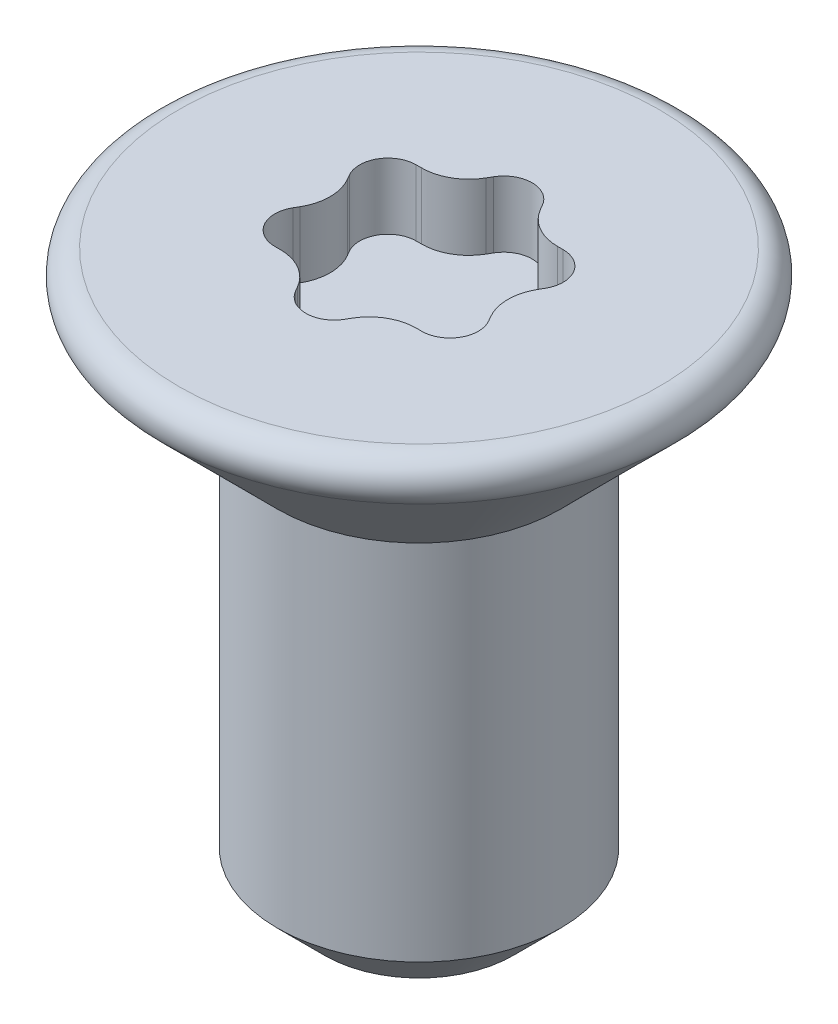
ISO-10303-21;
HEADER;
FILE_DESCRIPTION(('STEP AP214'),'2;1');
FILE_NAME('part.step','',(''),(''),'','','');
FILE_SCHEMA(('AUTOMOTIVE_DESIGN { 1 0 10303 214 1 1 1 1 }'));
ENDSEC;
DATA;
#1=APPLICATION_CONTEXT('core data for automotive mechanical design processes');
#2=APPLICATION_PROTOCOL_DEFINITION('international standard','automotive_design',2000,#1);
#3=PRODUCT_CONTEXT('',#1,'mechanical');
#4=PRODUCT('Part','Part','',(#3));
#5=PRODUCT_RELATED_PRODUCT_CATEGORY('part','',(#4));
#6=PRODUCT_DEFINITION_FORMATION('','',#4);
#7=PRODUCT_DEFINITION_CONTEXT('part definition',#1,'design');
#8=PRODUCT_DEFINITION('design','',#6,#7);
#9=PRODUCT_DEFINITION_SHAPE('','',#8);
#10=(LENGTH_UNIT() NAMED_UNIT(*) SI_UNIT(.MILLI.,.METRE.));
#11=(NAMED_UNIT(*) PLANE_ANGLE_UNIT() SI_UNIT($,.RADIAN.));
#12=(NAMED_UNIT(*) SI_UNIT($,.STERADIAN.) SOLID_ANGLE_UNIT());
#13=UNCERTAINTY_MEASURE_WITH_UNIT(LENGTH_MEASURE(1.E-05),#10,'distance_accuracy_value','');
#14=(GEOMETRIC_REPRESENTATION_CONTEXT(3) GLOBAL_UNCERTAINTY_ASSIGNED_CONTEXT((#13)) GLOBAL_UNIT_ASSIGNED_CONTEXT((#10,
#11,#12)) REPRESENTATION_CONTEXT('',''));
#15=CARTESIAN_POINT('',(0.,0.,0.));
#16=DIRECTION('',(0.,0.,1.));
#17=DIRECTION('',(1.,0.,0.));
#18=AXIS2_PLACEMENT_3D('',#15,#16,#17);
#19=CARTESIAN_POINT('',(-0.721687836487033,-0.7,-1.25));
#20=DIRECTION('',(0.,1.,0.));
#21=DIRECTION('',(0.,0.,1.));
#22=AXIS2_PLACEMENT_3D('',#19,#20,#21);
#23=PLANE('',#22);
#24=CARTESIAN_POINT('',(0.,-0.7,-0.900000000000001));
#25=DIRECTION('',(0.,1.,0.));
#26=DIRECTION('',(0.,0.,1.));
#27=AXIS2_PLACEMENT_3D('',#24,#25,#26);
#28=CIRCLE('',#27,0.3);
#29=CARTESIAN_POINT('',(0.259807621135331,-0.7,-1.05));
#30=VERTEX_POINT('',#29);
#31=CARTESIAN_POINT('',(-0.259807621135332,-0.7,-1.05));
#32=VERTEX_POINT('',#31);
#33=EDGE_CURVE('E259',#30,#32,#28,.T.);
#34=ORIENTED_EDGE('',*,*,#33,.T.);
#35=DIRECTION('',(0.5,0.,-0.866025403784438));
#36=VECTOR('',#35,1.);
#37=CARTESIAN_POINT('',(-0.288675134594814,-0.7,-1.));
#38=LINE('',#37,#36);
#39=CARTESIAN_POINT('',(-0.288675134594814,-0.7,-1.));
#40=VERTEX_POINT('',#39);
#41=EDGE_CURVE('E261',#40,#32,#38,.T.);
#42=ORIENTED_EDGE('',*,*,#41,.F.);
#43=CARTESIAN_POINT('',(-0.721687836487033,-0.7,-1.25));
#44=DIRECTION('',(0.,1.,0.));
#45=DIRECTION('',(0.,0.,1.));
#46=AXIS2_PLACEMENT_3D('',#43,#44,#45);
#47=CIRCLE('',#46,0.5);
#48=CARTESIAN_POINT('',(-0.721687836487033,-0.7,-0.75));
#49=VERTEX_POINT('',#48);
#50=EDGE_CURVE('E254',#49,#40,#47,.T.);
#51=ORIENTED_EDGE('',*,*,#50,.F.);
#52=DIRECTION('',(1.,0.,0.));
#53=VECTOR('',#52,1.);
#54=CARTESIAN_POINT('',(-0.779422863405995,-0.7,-0.75));
#55=LINE('',#54,#53);
#56=CARTESIAN_POINT('',(-0.779422863405995,-0.7,-0.75));
#57=VERTEX_POINT('',#56);
#58=EDGE_CURVE('E183',#57,#49,#55,.T.);
#59=ORIENTED_EDGE('',*,*,#58,.F.);
#60=CARTESIAN_POINT('',(-0.779422863405995,-0.7,-0.45));
#61=DIRECTION('',(0.,1.,0.));
#62=DIRECTION('',(0.,0.,1.));
#63=AXIS2_PLACEMENT_3D('',#60,#61,#62);
#64=CIRCLE('',#63,0.3);
#65=CARTESIAN_POINT('',(-1.03923048454133,-0.7,-0.3));
#66=VERTEX_POINT('',#65);
#67=EDGE_CURVE('E186',#57,#66,#64,.T.);
#68=ORIENTED_EDGE('',*,*,#67,.T.);
#69=DIRECTION('',(-0.500000000000001,0.,-0.866025403784438));
#70=VECTOR('',#69,1.);
#71=CARTESIAN_POINT('',(-1.01036297108185,-0.7,-0.25));
#72=LINE('',#71,#70);
#73=CARTESIAN_POINT('',(-1.01036297108185,-0.7,-0.25));
#74=VERTEX_POINT('',#73);
#75=EDGE_CURVE('E189',#74,#66,#72,.T.);
#76=ORIENTED_EDGE('',*,*,#75,.F.);
#77=CARTESIAN_POINT('',(-1.44337567297407,-0.7,0.));
#78=DIRECTION('',(0.,1.,0.));
#79=DIRECTION('',(0.,0.,1.));
#80=AXIS2_PLACEMENT_3D('',#77,#78,#79);
#81=CIRCLE('',#80,0.5);
#82=CARTESIAN_POINT('',(-1.01036297108185,-0.7,0.249999999999999));
#83=VERTEX_POINT('',#82);
#84=EDGE_CURVE('E202',#83,#74,#81,.T.);
#85=ORIENTED_EDGE('',*,*,#84,.F.);
#86=DIRECTION('',(0.499999999999995,0.,-0.866025403784441));
#87=VECTOR('',#86,1.);
#88=CARTESIAN_POINT('',(-1.03923048454133,-0.7,0.300000000000001));
#89=LINE('',#88,#87);
#90=CARTESIAN_POINT('',(-1.03923048454133,-0.7,0.300000000000001));
#91=VERTEX_POINT('',#90);
#92=EDGE_CURVE('E211',#91,#83,#89,.T.);
#93=ORIENTED_EDGE('',*,*,#92,.F.);
#94=CARTESIAN_POINT('',(-0.779422863405996,-0.7,0.450000000000001));
#95=DIRECTION('',(0.,1.,0.));
#96=DIRECTION('',(0.,0.,1.));
#97=AXIS2_PLACEMENT_3D('',#94,#95,#96);
#98=CIRCLE('',#97,0.3);
#99=CARTESIAN_POINT('',(-0.779422863405997,-0.7,0.75));
#100=VERTEX_POINT('',#99);
#101=EDGE_CURVE('E295',#91,#100,#98,.T.);
#102=ORIENTED_EDGE('',*,*,#101,.T.);
#103=DIRECTION('',(-1.,0.,0.));
#104=VECTOR('',#103,1.);
#105=CARTESIAN_POINT('',(-0.721687836487033,-0.7,0.750000000000001));
#106=LINE('',#105,#104);
#107=CARTESIAN_POINT('',(-0.721687836487031,-0.7,0.750000000000001));
#108=VERTEX_POINT('',#107);
#109=EDGE_CURVE('E297',#108,#100,#106,.T.);
#110=ORIENTED_EDGE('',*,*,#109,.F.);
#111=CARTESIAN_POINT('',(-0.721687836487033,-0.7,1.25));
#112=DIRECTION('',(0.,1.,0.));
#113=DIRECTION('',(0.,0.,1.));
#114=AXIS2_PLACEMENT_3D('',#111,#112,#113);
#115=CIRCLE('',#114,0.5);
#116=CARTESIAN_POINT('',(-0.288675134594814,-0.7,1.));
#117=VERTEX_POINT('',#116);
#118=EDGE_CURVE('E290',#117,#108,#115,.T.);
#119=ORIENTED_EDGE('',*,*,#118,.F.);
#120=DIRECTION('',(-0.500000000000002,0.,-0.866025403784438));
#121=VECTOR('',#120,1.);
#122=CARTESIAN_POINT('',(-0.259807621135332,-0.7,1.05));
#123=LINE('',#122,#121);
#124=CARTESIAN_POINT('',(-0.259807621135331,-0.7,1.05));
#125=VERTEX_POINT('',#124);
#126=EDGE_CURVE('E495',#125,#117,#123,.T.);
#127=ORIENTED_EDGE('',*,*,#126,.F.);
#128=CARTESIAN_POINT('',(0.,-0.7,0.900000000000001));
#129=DIRECTION('',(0.,1.,0.));
#130=DIRECTION('',(0.,0.,1.));
#131=AXIS2_PLACEMENT_3D('',#128,#129,#130);
#132=CIRCLE('',#131,0.3);
#133=CARTESIAN_POINT('',(0.259807621135332,-0.7,1.05));
#134=VERTEX_POINT('',#133);
#135=EDGE_CURVE('E286',#125,#134,#132,.T.);
#136=ORIENTED_EDGE('',*,*,#135,.T.);
#137=DIRECTION('',(-0.499999999999999,0.,0.866025403784439));
#138=VECTOR('',#137,1.);
#139=CARTESIAN_POINT('',(0.288675134594813,-0.7,1.));
#140=LINE('',#139,#138);
#141=CARTESIAN_POINT('',(0.288675134594813,-0.7,1.));
#142=VERTEX_POINT('',#141);
#143=EDGE_CURVE('E288',#142,#134,#140,.T.);
#144=ORIENTED_EDGE('',*,*,#143,.F.);
#145=CARTESIAN_POINT('',(0.721687836487033,-0.7,1.25));
#146=DIRECTION('',(0.,1.,0.));
#147=DIRECTION('',(0.,0.,1.));
#148=AXIS2_PLACEMENT_3D('',#145,#146,#147);
#149=CIRCLE('',#148,0.5);
#150=CARTESIAN_POINT('',(0.721687836487032,-0.7,0.750000000000001));
#151=VERTEX_POINT('',#150);
#152=EDGE_CURVE('E281',#151,#142,#149,.T.);
#153=ORIENTED_EDGE('',*,*,#152,.F.);
#154=DIRECTION('',(-1.,0.,0.));
#155=VECTOR('',#154,1.);
#156=CARTESIAN_POINT('',(0.779422863405995,-0.7,0.750000000000001));
#157=LINE('',#156,#155);
#158=CARTESIAN_POINT('',(0.779422863405995,-0.7,0.750000000000001));
#159=VERTEX_POINT('',#158);
#160=EDGE_CURVE('E485',#159,#151,#157,.T.);
#161=ORIENTED_EDGE('',*,*,#160,.F.);
#162=CARTESIAN_POINT('',(0.779422863405995,-0.7,0.450000000000001));
#163=DIRECTION('',(0.,1.,0.));
#164=DIRECTION('',(0.,0.,1.));
#165=AXIS2_PLACEMENT_3D('',#162,#163,#164);
#166=CIRCLE('',#165,0.3);
#167=CARTESIAN_POINT('',(1.03923048454133,-0.7,0.300000000000001));
#168=VERTEX_POINT('',#167);
#169=EDGE_CURVE('E277',#159,#168,#166,.T.);
#170=ORIENTED_EDGE('',*,*,#169,.T.);
#171=DIRECTION('',(0.499999999999997,0.,0.866025403784441));
#172=VECTOR('',#171,1.);
#173=CARTESIAN_POINT('',(1.01036297108185,-0.7,0.250000000000001));
#174=LINE('',#173,#172);
#175=CARTESIAN_POINT('',(1.01036297108185,-0.7,0.25));
#176=VERTEX_POINT('',#175);
#177=EDGE_CURVE('E279',#176,#168,#174,.T.);
#178=ORIENTED_EDGE('',*,*,#177,.F.);
#179=CARTESIAN_POINT('',(1.44337567297406,-0.7,0.));
#180=DIRECTION('',(0.,1.,0.));
#181=DIRECTION('',(0.,0.,1.));
#182=AXIS2_PLACEMENT_3D('',#179,#180,#181);
#183=CIRCLE('',#182,0.5);
#184=CARTESIAN_POINT('',(1.01036297108185,-0.7,-0.25));
#185=VERTEX_POINT('',#184);
#186=EDGE_CURVE('E272',#185,#176,#183,.T.);
#187=ORIENTED_EDGE('',*,*,#186,.F.);
#188=DIRECTION('',(-0.500000000000003,0.,0.866025403784437));
#189=VECTOR('',#188,1.);
#190=CARTESIAN_POINT('',(1.03923048454133,-0.7,-0.3));
#191=LINE('',#190,#189);
#192=CARTESIAN_POINT('',(1.03923048454133,-0.7,-0.299999999999999));
#193=VERTEX_POINT('',#192);
#194=EDGE_CURVE('E475',#193,#185,#191,.T.);
#195=ORIENTED_EDGE('',*,*,#194,.F.);
#196=CARTESIAN_POINT('',(0.779422863405996,-0.7,-0.45));
#197=DIRECTION('',(0.,1.,0.));
#198=DIRECTION('',(0.,0.,1.));
#199=AXIS2_PLACEMENT_3D('',#196,#197,#198);
#200=CIRCLE('',#199,0.3);
#201=CARTESIAN_POINT('',(0.779422863405996,-0.7,-0.749999999999999));
#202=VERTEX_POINT('',#201);
#203=EDGE_CURVE('E268',#193,#202,#200,.T.);
#204=ORIENTED_EDGE('',*,*,#203,.T.);
#205=DIRECTION('',(1.,0.,0.));
#206=VECTOR('',#205,1.);
#207=CARTESIAN_POINT('',(0.721687836487033,-0.7,-0.749999999999999));
#208=LINE('',#207,#206);
#209=CARTESIAN_POINT('',(0.721687836487033,-0.7,-0.75));
#210=VERTEX_POINT('',#209);
#211=EDGE_CURVE('E270',#210,#202,#208,.T.);
#212=ORIENTED_EDGE('',*,*,#211,.F.);
#213=CARTESIAN_POINT('',(0.721687836487033,-0.7,-1.25));
#214=DIRECTION('',(0.,1.,0.));
#215=DIRECTION('',(0.,0.,1.));
#216=AXIS2_PLACEMENT_3D('',#213,#214,#215);
#217=CIRCLE('',#216,0.5);
#218=CARTESIAN_POINT('',(0.288675134594814,-0.7,-0.999999999999999));
#219=VERTEX_POINT('',#218);
#220=EDGE_CURVE('E263',#219,#210,#217,.T.);
#221=ORIENTED_EDGE('',*,*,#220,.F.);
#222=DIRECTION('',(0.500000000000004,0.,0.866025403784436));
#223=VECTOR('',#222,1.);
#224=CARTESIAN_POINT('',(0.259807621135331,-0.7,-1.05));
#225=LINE('',#224,#223);
#226=EDGE_CURVE('E465',#30,#219,#225,.T.);
#227=ORIENTED_EDGE('',*,*,#226,.F.);
#228=EDGE_LOOP('',(#34,#42,#51,#59,#68,#76,#85,#93,#102,#110,#119,#127,#136,#144,#153,#161,#170,
#178,#187,#195,#204,#212,#221,#227));
#229=FACE_BOUND('',#228,.T.);
#230=ADVANCED_FACE('F17',(#229),#23,.T.);
#231=CARTESIAN_POINT('',(-0.779422863405995,-0.7,-0.75));
#232=DIRECTION('',(0.,0.,1.));
#233=DIRECTION('',(1.,0.,0.));
#234=AXIS2_PLACEMENT_3D('',#231,#232,#233);
#235=PLANE('',#234);
#236=ORIENTED_EDGE('',*,*,#58,.T.);
#237=DIRECTION('',(0.,1.,0.));
#238=VECTOR('',#237,1.);
#239=CARTESIAN_POINT('',(-0.721687836487033,-0.7,-0.75));
#240=LINE('',#239,#238);
#241=CARTESIAN_POINT('',(-0.721687836487033,0.,-0.75));
#242=VERTEX_POINT('',#241);
#243=EDGE_CURVE('E258',#242,#49,#240,.F.);
#244=ORIENTED_EDGE('',*,*,#243,.F.);
#245=DIRECTION('',(1.,0.,0.));
#246=VECTOR('',#245,1.);
#247=CARTESIAN_POINT('',(0.,0.,-0.75));
#248=LINE('',#247,#246);
#249=CARTESIAN_POINT('',(-0.779422863405995,0.,-0.75));
#250=VERTEX_POINT('',#249);
#251=EDGE_CURVE('E253',#242,#250,#248,.F.);
#252=ORIENTED_EDGE('',*,*,#251,.T.);
#253=DIRECTION('',(0.,1.,0.));
#254=VECTOR('',#253,1.);
#255=CARTESIAN_POINT('',(-0.779422863405995,-0.7,-0.75));
#256=LINE('',#255,#254);
#257=EDGE_CURVE('E193',#250,#57,#256,.F.);
#258=ORIENTED_EDGE('',*,*,#257,.T.);
#259=EDGE_LOOP('',(#236,#244,#252,#258));
#260=FACE_BOUND('',#259,.T.);
#261=ADVANCED_FACE('F413',(#260),#235,.T.);
#262=CARTESIAN_POINT('',(-0.779422863405995,-0.7,-0.45));
#263=DIRECTION('',(0.,1.,0.));
#264=DIRECTION('',(0.,0.,1.));
#265=AXIS2_PLACEMENT_3D('',#262,#263,#264);
#266=CYLINDRICAL_SURFACE('',#265,0.3);
#267=DIRECTION('',(0.,1.,0.));
#268=VECTOR('',#267,1.);
#269=CARTESIAN_POINT('',(-1.03923048454133,-0.7,-0.3));
#270=LINE('',#269,#268);
#271=CARTESIAN_POINT('',(-1.03923048454133,0.,-0.3));
#272=VERTEX_POINT('',#271);
#273=EDGE_CURVE('E196',#66,#272,#270,.T.);
#274=ORIENTED_EDGE('',*,*,#273,.F.);
#275=ORIENTED_EDGE('',*,*,#67,.F.);
#276=ORIENTED_EDGE('',*,*,#257,.F.);
#277=CARTESIAN_POINT('',(-0.779422863405995,0.,-0.45));
#278=DIRECTION('',(0.,1.,0.));
#279=DIRECTION('',(0.,0.,1.));
#280=AXIS2_PLACEMENT_3D('',#277,#278,#279);
#281=CIRCLE('',#280,0.3);
#282=EDGE_CURVE('E199',#250,#272,#281,.T.);
#283=ORIENTED_EDGE('',*,*,#282,.T.);
#284=EDGE_LOOP('',(#274,#275,#276,#283));
#285=FACE_BOUND('',#284,.T.);
#286=ADVANCED_FACE('F197',(#285),#266,.F.);
#287=CARTESIAN_POINT('',(-1.01036297108185,-0.7,-0.25));
#288=DIRECTION('',(0.866025403784438,0.,-0.500000000000001));
#289=DIRECTION('',(-0.500000000000001,0.,-0.866025403784438));
#290=AXIS2_PLACEMENT_3D('',#287,#288,#289);
#291=PLANE('',#290);
#292=ORIENTED_EDGE('',*,*,#75,.T.);
#293=ORIENTED_EDGE('',*,*,#273,.T.);
#294=DIRECTION('',(0.499999999999999,0.,0.866025403784439));
#295=VECTOR('',#294,1.);
#296=CARTESIAN_POINT('',(-1.03923048454133,0.,-0.3));
#297=LINE('',#296,#295);
#298=CARTESIAN_POINT('',(-1.01036297108185,0.,-0.249999999999999));
#299=VERTEX_POINT('',#298);
#300=EDGE_CURVE('E251',#272,#299,#297,.T.);
#301=ORIENTED_EDGE('',*,*,#300,.T.);
#302=DIRECTION('',(0.,1.,0.));
#303=VECTOR('',#302,1.);
#304=CARTESIAN_POINT('',(-1.01036297108185,-0.7,-0.25));
#305=LINE('',#304,#303);
#306=EDGE_CURVE('E206',#74,#299,#305,.T.);
#307=ORIENTED_EDGE('',*,*,#306,.F.);
#308=EDGE_LOOP('',(#292,#293,#301,#307));
#309=FACE_BOUND('',#308,.T.);
#310=ADVANCED_FACE('F204',(#309),#291,.T.);
#311=CARTESIAN_POINT('',(-1.44337567297407,-0.7,0.));
#312=DIRECTION('',(0.,1.,0.));
#313=DIRECTION('',(0.,0.,1.));
#314=AXIS2_PLACEMENT_3D('',#311,#312,#313);
#315=CYLINDRICAL_SURFACE('',#314,0.5);
#316=ORIENTED_EDGE('',*,*,#84,.T.);
#317=ORIENTED_EDGE('',*,*,#306,.T.);
#318=CARTESIAN_POINT('',(-1.44337567297407,0.,0.));
#319=DIRECTION('',(0.,1.,0.));
#320=DIRECTION('',(0.,0.,1.));
#321=AXIS2_PLACEMENT_3D('',#318,#319,#320);
#322=CIRCLE('',#321,0.5);
#323=CARTESIAN_POINT('',(-1.01036297108185,0.,0.249999999999999));
#324=VERTEX_POINT('',#323);
#325=EDGE_CURVE('E249',#299,#324,#322,.F.);
#326=ORIENTED_EDGE('',*,*,#325,.T.);
#327=DIRECTION('',(0.,1.,0.));
#328=VECTOR('',#327,1.);
#329=CARTESIAN_POINT('',(-1.01036297108185,-0.7,0.25));
#330=LINE('',#329,#328);
#331=EDGE_CURVE('E502',#83,#324,#330,.T.);
#332=ORIENTED_EDGE('',*,*,#331,.F.);
#333=EDGE_LOOP('',(#316,#317,#326,#332));
#334=FACE_BOUND('',#333,.T.);
#335=ADVANCED_FACE('F405',(#334),#315,.T.);
#336=CARTESIAN_POINT('',(-1.03923048454133,-0.7,0.300000000000001));
#337=DIRECTION('',(0.866025403784441,0.,0.499999999999995));
#338=DIRECTION('',(0.499999999999995,0.,-0.866025403784441));
#339=AXIS2_PLACEMENT_3D('',#336,#337,#338);
#340=PLANE('',#339);
#341=ORIENTED_EDGE('',*,*,#92,.T.);
#342=ORIENTED_EDGE('',*,*,#331,.T.);
#343=DIRECTION('',(-0.499999999999995,0.,0.866025403784441));
#344=VECTOR('',#343,1.);
#345=CARTESIAN_POINT('',(-1.01036297108185,0.,0.25));
#346=LINE('',#345,#344);
#347=CARTESIAN_POINT('',(-1.03923048454133,0.,0.300000000000001));
#348=VERTEX_POINT('',#347);
#349=EDGE_CURVE('E248',#324,#348,#346,.T.);
#350=ORIENTED_EDGE('',*,*,#349,.T.);
#351=DIRECTION('',(0.,1.,0.));
#352=VECTOR('',#351,1.);
#353=CARTESIAN_POINT('',(-1.03923048454133,-0.7,0.300000000000001));
#354=LINE('',#353,#352);
#355=EDGE_CURVE('E298',#348,#91,#354,.F.);
#356=ORIENTED_EDGE('',*,*,#355,.T.);
#357=EDGE_LOOP('',(#341,#342,#350,#356));
#358=FACE_BOUND('',#357,.T.);
#359=ADVANCED_FACE('F401',(#358),#340,.T.);
#360=CARTESIAN_POINT('',(-0.779422863405996,-0.7,0.450000000000001));
#361=DIRECTION('',(0.,1.,0.));
#362=DIRECTION('',(0.,0.,1.));
#363=AXIS2_PLACEMENT_3D('',#360,#361,#362);
#364=CYLINDRICAL_SURFACE('',#363,0.3);
#365=DIRECTION('',(0.,1.,0.));
#366=VECTOR('',#365,1.);
#367=CARTESIAN_POINT('',(-0.779422863405996,-0.7,0.75));
#368=LINE('',#367,#366);
#369=CARTESIAN_POINT('',(-0.779422863405996,0.,0.75));
#370=VERTEX_POINT('',#369);
#371=EDGE_CURVE('E294',#100,#370,#368,.T.);
#372=ORIENTED_EDGE('',*,*,#371,.F.);
#373=ORIENTED_EDGE('',*,*,#101,.F.);
#374=ORIENTED_EDGE('',*,*,#355,.F.);
#375=CARTESIAN_POINT('',(-0.779422863405996,0.,0.450000000000001));
#376=DIRECTION('',(0.,1.,0.));
#377=DIRECTION('',(0.,0.,1.));
#378=AXIS2_PLACEMENT_3D('',#375,#376,#377);
#379=CIRCLE('',#378,0.3);
#380=EDGE_CURVE('E246',#348,#370,#379,.T.);
#381=ORIENTED_EDGE('',*,*,#380,.T.);
#382=EDGE_LOOP('',(#372,#373,#374,#381));
#383=FACE_BOUND('',#382,.T.);
#384=ADVANCED_FACE('F397',(#383),#364,.F.);
#385=CARTESIAN_POINT('',(-0.721687836487033,-0.7,0.750000000000001));
#386=DIRECTION('',(0.,0.,-1.));
#387=DIRECTION('',(-1.,0.,0.));
#388=AXIS2_PLACEMENT_3D('',#385,#386,#387);
#389=PLANE('',#388);
#390=ORIENTED_EDGE('',*,*,#109,.T.);
#391=ORIENTED_EDGE('',*,*,#371,.T.);
#392=DIRECTION('',(1.,0.,0.));
#393=VECTOR('',#392,1.);
#394=CARTESIAN_POINT('',(0.,0.,0.75));
#395=LINE('',#394,#393);
#396=CARTESIAN_POINT('',(-0.721687836487033,0.,0.75));
#397=VERTEX_POINT('',#396);
#398=EDGE_CURVE('E245',#370,#397,#395,.T.);
#399=ORIENTED_EDGE('',*,*,#398,.T.);
#400=DIRECTION('',(0.,1.,0.));
#401=VECTOR('',#400,1.);
#402=CARTESIAN_POINT('',(-0.721687836487033,-0.7,0.750000000000001));
#403=LINE('',#402,#401);
#404=EDGE_CURVE('E293',#108,#397,#403,.T.);
#405=ORIENTED_EDGE('',*,*,#404,.F.);
#406=EDGE_LOOP('',(#390,#391,#399,#405));
#407=FACE_BOUND('',#406,.T.);
#408=ADVANCED_FACE('F393',(#407),#389,.T.);
#409=CARTESIAN_POINT('',(-0.721687836487033,-0.7,1.25));
#410=DIRECTION('',(0.,1.,0.));
#411=DIRECTION('',(0.,0.,1.));
#412=AXIS2_PLACEMENT_3D('',#409,#410,#411);
#413=CYLINDRICAL_SURFACE('',#412,0.5);
#414=ORIENTED_EDGE('',*,*,#118,.T.);
#415=ORIENTED_EDGE('',*,*,#404,.T.);
#416=CARTESIAN_POINT('',(-0.721687836487033,0.,1.25));
#417=DIRECTION('',(0.,1.,0.));
#418=DIRECTION('',(0.,0.,1.));
#419=AXIS2_PLACEMENT_3D('',#416,#417,#418);
#420=CIRCLE('',#419,0.5);
#421=CARTESIAN_POINT('',(-0.288675134594814,0.,1.));
#422=VERTEX_POINT('',#421);
#423=EDGE_CURVE('E243',#397,#422,#420,.F.);
#424=ORIENTED_EDGE('',*,*,#423,.T.);
#425=DIRECTION('',(0.,1.,0.));
#426=VECTOR('',#425,1.);
#427=CARTESIAN_POINT('',(-0.288675134594813,-0.7,1.));
#428=LINE('',#427,#426);
#429=EDGE_CURVE('E492',#117,#422,#428,.T.);
#430=ORIENTED_EDGE('',*,*,#429,.F.);
#431=EDGE_LOOP('',(#414,#415,#424,#430));
#432=FACE_BOUND('',#431,.T.);
#433=ADVANCED_FACE('F389',(#432),#413,.T.);
#434=CARTESIAN_POINT('',(-0.259807621135332,-0.7,1.05));
#435=DIRECTION('',(0.866025403784438,0.,-0.500000000000002));
#436=DIRECTION('',(-0.500000000000002,0.,-0.866025403784438));
#437=AXIS2_PLACEMENT_3D('',#434,#435,#436);
#438=PLANE('',#437);
#439=ORIENTED_EDGE('',*,*,#126,.T.);
#440=ORIENTED_EDGE('',*,*,#429,.T.);
#441=DIRECTION('',(0.500000000000002,0.,0.866025403784438));
#442=VECTOR('',#441,1.);
#443=CARTESIAN_POINT('',(-0.288675134594813,0.,1.));
#444=LINE('',#443,#442);
#445=CARTESIAN_POINT('',(-0.259807621135331,0.,1.05));
#446=VERTEX_POINT('',#445);
#447=EDGE_CURVE('E242',#422,#446,#444,.T.);
#448=ORIENTED_EDGE('',*,*,#447,.T.);
#449=DIRECTION('',(0.,1.,0.));
#450=VECTOR('',#449,1.);
#451=CARTESIAN_POINT('',(-0.259807621135332,-0.7,1.05));
#452=LINE('',#451,#450);
#453=EDGE_CURVE('E289',#446,#125,#452,.F.);
#454=ORIENTED_EDGE('',*,*,#453,.T.);
#455=EDGE_LOOP('',(#439,#440,#448,#454));
#456=FACE_BOUND('',#455,.T.);
#457=ADVANCED_FACE('F385',(#456),#438,.T.);
#458=CARTESIAN_POINT('',(0.,-0.7,0.900000000000001));
#459=DIRECTION('',(0.,1.,0.));
#460=DIRECTION('',(0.,0.,1.));
#461=AXIS2_PLACEMENT_3D('',#458,#459,#460);
#462=CYLINDRICAL_SURFACE('',#461,0.3);
#463=ORIENTED_EDGE('',*,*,#135,.F.);
#464=ORIENTED_EDGE('',*,*,#453,.F.);
#465=CARTESIAN_POINT('',(0.,0.,0.900000000000001));
#466=DIRECTION('',(0.,1.,0.));
#467=DIRECTION('',(0.,0.,1.));
#468=AXIS2_PLACEMENT_3D('',#465,#466,#467);
#469=CIRCLE('',#468,0.3);
#470=CARTESIAN_POINT('',(0.259807621135332,0.,1.05));
#471=VERTEX_POINT('',#470);
#472=EDGE_CURVE('E240',#446,#471,#469,.T.);
#473=ORIENTED_EDGE('',*,*,#472,.T.);
#474=DIRECTION('',(0.,1.,0.));
#475=VECTOR('',#474,1.);
#476=CARTESIAN_POINT('',(0.259807621135332,-0.7,1.05));
#477=LINE('',#476,#475);
#478=EDGE_CURVE('E285',#134,#471,#477,.T.);
#479=ORIENTED_EDGE('',*,*,#478,.F.);
#480=EDGE_LOOP('',(#463,#464,#473,#479));
#481=FACE_BOUND('',#480,.T.);
#482=ADVANCED_FACE('F381',(#481),#462,.F.);
#483=CARTESIAN_POINT('',(0.288675134594813,-0.7,1.));
#484=DIRECTION('',(-0.866025403784439,0.,-0.499999999999999));
#485=DIRECTION('',(-0.499999999999999,0.,0.866025403784439));
#486=AXIS2_PLACEMENT_3D('',#483,#484,#485);
#487=PLANE('',#486);
#488=ORIENTED_EDGE('',*,*,#143,.T.);
#489=ORIENTED_EDGE('',*,*,#478,.T.);
#490=DIRECTION('',(0.499999999999997,0.,-0.86602540378444));
#491=VECTOR('',#490,1.);
#492=CARTESIAN_POINT('',(0.259807621135332,0.,1.05));
#493=LINE('',#492,#491);
#494=CARTESIAN_POINT('',(0.288675134594813,0.,1.));
#495=VERTEX_POINT('',#494);
#496=EDGE_CURVE('E239',#471,#495,#493,.T.);
#497=ORIENTED_EDGE('',*,*,#496,.T.);
#498=DIRECTION('',(0.,1.,0.));
#499=VECTOR('',#498,1.);
#500=CARTESIAN_POINT('',(0.288675134594814,-0.7,1.));
#501=LINE('',#500,#499);
#502=EDGE_CURVE('E284',#142,#495,#501,.T.);
#503=ORIENTED_EDGE('',*,*,#502,.F.);
#504=EDGE_LOOP('',(#488,#489,#497,#503));
#505=FACE_BOUND('',#504,.T.);
#506=ADVANCED_FACE('F377',(#505),#487,.T.);
#507=CARTESIAN_POINT('',(0.721687836487033,-0.7,1.25));
#508=DIRECTION('',(0.,1.,0.));
#509=DIRECTION('',(0.,0.,1.));
#510=AXIS2_PLACEMENT_3D('',#507,#508,#509);
#511=CYLINDRICAL_SURFACE('',#510,0.5);
#512=ORIENTED_EDGE('',*,*,#152,.T.);
#513=ORIENTED_EDGE('',*,*,#502,.T.);
#514=CARTESIAN_POINT('',(0.721687836487033,0.,1.25));
#515=DIRECTION('',(0.,1.,0.));
#516=DIRECTION('',(0.,0.,1.));
#517=AXIS2_PLACEMENT_3D('',#514,#515,#516);
#518=CIRCLE('',#517,0.5);
#519=CARTESIAN_POINT('',(0.721687836487033,0.,0.750000000000001));
#520=VERTEX_POINT('',#519);
#521=EDGE_CURVE('E237',#495,#520,#518,.F.);
#522=ORIENTED_EDGE('',*,*,#521,.T.);
#523=DIRECTION('',(0.,1.,0.));
#524=VECTOR('',#523,1.);
#525=CARTESIAN_POINT('',(0.721687836487033,-0.7,0.750000000000001));
#526=LINE('',#525,#524);
#527=EDGE_CURVE('E482',#151,#520,#526,.T.);
#528=ORIENTED_EDGE('',*,*,#527,.F.);
#529=EDGE_LOOP('',(#512,#513,#522,#528));
#530=FACE_BOUND('',#529,.T.);
#531=ADVANCED_FACE('F373',(#530),#511,.T.);
#532=CARTESIAN_POINT('',(0.779422863405995,-0.7,0.750000000000001));
#533=DIRECTION('',(0.,0.,-1.));
#534=DIRECTION('',(-1.,0.,0.));
#535=AXIS2_PLACEMENT_3D('',#532,#533,#534);
#536=PLANE('',#535);
#537=ORIENTED_EDGE('',*,*,#160,.T.);
#538=ORIENTED_EDGE('',*,*,#527,.T.);
#539=DIRECTION('',(1.,0.,0.));
#540=VECTOR('',#539,1.);
#541=CARTESIAN_POINT('',(0.,0.,0.750000000000001));
#542=LINE('',#541,#540);
#543=CARTESIAN_POINT('',(0.779422863405995,0.,0.750000000000001));
#544=VERTEX_POINT('',#543);
#545=EDGE_CURVE('E236',#520,#544,#542,.T.);
#546=ORIENTED_EDGE('',*,*,#545,.T.);
#547=DIRECTION('',(0.,1.,0.));
#548=VECTOR('',#547,1.);
#549=CARTESIAN_POINT('',(0.779422863405995,-0.7,0.750000000000001));
#550=LINE('',#549,#548);
#551=EDGE_CURVE('E280',#544,#159,#550,.F.);
#552=ORIENTED_EDGE('',*,*,#551,.T.);
#553=EDGE_LOOP('',(#537,#538,#546,#552));
#554=FACE_BOUND('',#553,.T.);
#555=ADVANCED_FACE('F369',(#554),#536,.T.);
#556=CARTESIAN_POINT('',(0.779422863405995,-0.7,0.450000000000001));
#557=DIRECTION('',(0.,1.,0.));
#558=DIRECTION('',(0.,0.,1.));
#559=AXIS2_PLACEMENT_3D('',#556,#557,#558);
#560=CYLINDRICAL_SURFACE('',#559,0.3);
#561=DIRECTION('',(0.,1.,0.));
#562=VECTOR('',#561,1.);
#563=CARTESIAN_POINT('',(1.03923048454133,-0.7,0.300000000000001));
#564=LINE('',#563,#562);
#565=CARTESIAN_POINT('',(1.03923048454133,0.,0.300000000000001));
#566=VERTEX_POINT('',#565);
#567=EDGE_CURVE('E276',#168,#566,#564,.T.);
#568=ORIENTED_EDGE('',*,*,#567,.F.);
#569=ORIENTED_EDGE('',*,*,#169,.F.);
#570=ORIENTED_EDGE('',*,*,#551,.F.);
#571=CARTESIAN_POINT('',(0.779422863405995,0.,0.450000000000001));
#572=DIRECTION('',(0.,1.,0.));
#573=DIRECTION('',(0.,0.,1.));
#574=AXIS2_PLACEMENT_3D('',#571,#572,#573);
#575=CIRCLE('',#574,0.3);
#576=EDGE_CURVE('E234',#544,#566,#575,.T.);
#577=ORIENTED_EDGE('',*,*,#576,.T.);
#578=EDGE_LOOP('',(#568,#569,#570,#577));
#579=FACE_BOUND('',#578,.T.);
#580=ADVANCED_FACE('F365',(#579),#560,.F.);
#581=CARTESIAN_POINT('',(1.01036297108185,-0.7,0.250000000000001));
#582=DIRECTION('',(-0.866025403784441,0.,0.499999999999997));
#583=DIRECTION('',(0.499999999999997,0.,0.866025403784441));
#584=AXIS2_PLACEMENT_3D('',#581,#582,#583);
#585=PLANE('',#584);
#586=ORIENTED_EDGE('',*,*,#177,.T.);
#587=ORIENTED_EDGE('',*,*,#567,.T.);
#588=DIRECTION('',(-0.499999999999996,0.,-0.866025403784441));
#589=VECTOR('',#588,1.);
#590=CARTESIAN_POINT('',(1.03923048454133,0.,0.300000000000001));
#591=LINE('',#590,#589);
#592=CARTESIAN_POINT('',(1.01036297108185,0.,0.249999999999999));
#593=VERTEX_POINT('',#592);
#594=EDGE_CURVE('E233',#566,#593,#591,.T.);
#595=ORIENTED_EDGE('',*,*,#594,.T.);
#596=DIRECTION('',(0.,1.,0.));
#597=VECTOR('',#596,1.);
#598=CARTESIAN_POINT('',(1.01036297108185,-0.7,0.25));
#599=LINE('',#598,#597);
#600=EDGE_CURVE('E275',#176,#593,#599,.T.);
#601=ORIENTED_EDGE('',*,*,#600,.F.);
#602=EDGE_LOOP('',(#586,#587,#595,#601));
#603=FACE_BOUND('',#602,.T.);
#604=ADVANCED_FACE('F361',(#603),#585,.T.);
#605=CARTESIAN_POINT('',(1.44337567297406,-0.7,0.));
#606=DIRECTION('',(0.,1.,0.));
#607=DIRECTION('',(0.,0.,1.));
#608=AXIS2_PLACEMENT_3D('',#605,#606,#607);
#609=CYLINDRICAL_SURFACE('',#608,0.5);
#610=ORIENTED_EDGE('',*,*,#186,.T.);
#611=ORIENTED_EDGE('',*,*,#600,.T.);
#612=CARTESIAN_POINT('',(1.44337567297406,0.,0.));
#613=DIRECTION('',(0.,1.,0.));
#614=DIRECTION('',(0.,0.,1.));
#615=AXIS2_PLACEMENT_3D('',#612,#613,#614);
#616=CIRCLE('',#615,0.5);
#617=CARTESIAN_POINT('',(1.01036297108185,0.,-0.249999999999999));
#618=VERTEX_POINT('',#617);
#619=EDGE_CURVE('E231',#593,#618,#616,.F.);
#620=ORIENTED_EDGE('',*,*,#619,.T.);
#621=DIRECTION('',(0.,1.,0.));
#622=VECTOR('',#621,1.);
#623=CARTESIAN_POINT('',(1.01036297108185,-0.7,-0.249999999999999));
#624=LINE('',#623,#622);
#625=EDGE_CURVE('E472',#185,#618,#624,.T.);
#626=ORIENTED_EDGE('',*,*,#625,.F.);
#627=EDGE_LOOP('',(#610,#611,#620,#626));
#628=FACE_BOUND('',#627,.T.);
#629=ADVANCED_FACE('F357',(#628),#609,.T.);
#630=CARTESIAN_POINT('',(1.03923048454133,-0.7,-0.3));
#631=DIRECTION('',(-0.866025403784437,0.,-0.500000000000003));
#632=DIRECTION('',(-0.500000000000003,0.,0.866025403784437));
#633=AXIS2_PLACEMENT_3D('',#630,#631,#632);
#634=PLANE('',#633);
#635=ORIENTED_EDGE('',*,*,#194,.T.);
#636=ORIENTED_EDGE('',*,*,#625,.T.);
#637=DIRECTION('',(0.499999999999997,0.,-0.866025403784441));
#638=VECTOR('',#637,1.);
#639=CARTESIAN_POINT('',(1.01036297108185,0.,-0.249999999999999));
#640=LINE('',#639,#638);
#641=CARTESIAN_POINT('',(1.03923048454133,0.,-0.3));
#642=VERTEX_POINT('',#641);
#643=EDGE_CURVE('E230',#618,#642,#640,.T.);
#644=ORIENTED_EDGE('',*,*,#643,.T.);
#645=DIRECTION('',(0.,1.,0.));
#646=VECTOR('',#645,1.);
#647=CARTESIAN_POINT('',(1.03923048454133,-0.7,-0.3));
#648=LINE('',#647,#646);
#649=EDGE_CURVE('E271',#642,#193,#648,.F.);
#650=ORIENTED_EDGE('',*,*,#649,.T.);
#651=EDGE_LOOP('',(#635,#636,#644,#650));
#652=FACE_BOUND('',#651,.T.);
#653=ADVANCED_FACE('F353',(#652),#634,.T.);
#654=CARTESIAN_POINT('',(0.779422863405996,-0.7,-0.45));
#655=DIRECTION('',(0.,1.,0.));
#656=DIRECTION('',(0.,0.,1.));
#657=AXIS2_PLACEMENT_3D('',#654,#655,#656);
#658=CYLINDRICAL_SURFACE('',#657,0.3);
#659=DIRECTION('',(0.,1.,0.));
#660=VECTOR('',#659,1.);
#661=CARTESIAN_POINT('',(0.779422863405996,-0.7,-0.749999999999999));
#662=LINE('',#661,#660);
#663=CARTESIAN_POINT('',(0.779422863405996,0.,-0.75));
#664=VERTEX_POINT('',#663);
#665=EDGE_CURVE('E267',#202,#664,#662,.T.);
#666=ORIENTED_EDGE('',*,*,#665,.F.);
#667=ORIENTED_EDGE('',*,*,#203,.F.);
#668=ORIENTED_EDGE('',*,*,#649,.F.);
#669=CARTESIAN_POINT('',(0.779422863405996,0.,-0.45));
#670=DIRECTION('',(0.,1.,0.));
#671=DIRECTION('',(0.,0.,1.));
#672=AXIS2_PLACEMENT_3D('',#669,#670,#671);
#673=CIRCLE('',#672,0.3);
#674=EDGE_CURVE('E228',#642,#664,#673,.T.);
#675=ORIENTED_EDGE('',*,*,#674,.T.);
#676=EDGE_LOOP('',(#666,#667,#668,#675));
#677=FACE_BOUND('',#676,.T.);
#678=ADVANCED_FACE('F349',(#677),#658,.F.);
#679=CARTESIAN_POINT('',(0.721687836487033,-0.7,-0.749999999999999));
#680=DIRECTION('',(0.,0.,1.));
#681=DIRECTION('',(1.,0.,0.));
#682=AXIS2_PLACEMENT_3D('',#679,#680,#681);
#683=PLANE('',#682);
#684=ORIENTED_EDGE('',*,*,#211,.T.);
#685=ORIENTED_EDGE('',*,*,#665,.T.);
#686=DIRECTION('',(1.,0.,0.));
#687=VECTOR('',#686,1.);
#688=CARTESIAN_POINT('',(0.,0.,-0.75));
#689=LINE('',#688,#687);
#690=CARTESIAN_POINT('',(0.721687836487033,0.,-0.75));
#691=VERTEX_POINT('',#690);
#692=EDGE_CURVE('E227',#664,#691,#689,.F.);
#693=ORIENTED_EDGE('',*,*,#692,.T.);
#694=DIRECTION('',(0.,1.,0.));
#695=VECTOR('',#694,1.);
#696=CARTESIAN_POINT('',(0.721687836487033,-0.7,-0.75));
#697=LINE('',#696,#695);
#698=EDGE_CURVE('E266',#210,#691,#697,.T.);
#699=ORIENTED_EDGE('',*,*,#698,.F.);
#700=EDGE_LOOP('',(#684,#685,#693,#699));
#701=FACE_BOUND('',#700,.T.);
#702=ADVANCED_FACE('F345',(#701),#683,.T.);
#703=CARTESIAN_POINT('',(0.721687836487033,-0.7,-1.25));
#704=DIRECTION('',(0.,1.,0.));
#705=DIRECTION('',(0.,0.,1.));
#706=AXIS2_PLACEMENT_3D('',#703,#704,#705);
#707=CYLINDRICAL_SURFACE('',#706,0.5);
#708=ORIENTED_EDGE('',*,*,#220,.T.);
#709=ORIENTED_EDGE('',*,*,#698,.T.);
#710=CARTESIAN_POINT('',(0.721687836487033,0.,-1.25));
#711=DIRECTION('',(0.,1.,0.));
#712=DIRECTION('',(0.,0.,1.));
#713=AXIS2_PLACEMENT_3D('',#710,#711,#712);
#714=CIRCLE('',#713,0.5);
#715=CARTESIAN_POINT('',(0.288675134594814,0.,-0.999999999999999));
#716=VERTEX_POINT('',#715);
#717=EDGE_CURVE('E225',#691,#716,#714,.F.);
#718=ORIENTED_EDGE('',*,*,#717,.T.);
#719=DIRECTION('',(0.,1.,0.));
#720=VECTOR('',#719,1.);
#721=CARTESIAN_POINT('',(0.288675134594813,-0.7,-1.));
#722=LINE('',#721,#720);
#723=EDGE_CURVE('E462',#219,#716,#722,.T.);
#724=ORIENTED_EDGE('',*,*,#723,.F.);
#725=EDGE_LOOP('',(#708,#709,#718,#724));
#726=FACE_BOUND('',#725,.T.);
#727=ADVANCED_FACE('F341',(#726),#707,.T.);
#728=CARTESIAN_POINT('',(0.259807621135331,-0.7,-1.05));
#729=DIRECTION('',(-0.866025403784436,0.,0.500000000000004));
#730=DIRECTION('',(0.500000000000004,0.,0.866025403784436));
#731=AXIS2_PLACEMENT_3D('',#728,#729,#730);
#732=PLANE('',#731);
#733=ORIENTED_EDGE('',*,*,#226,.T.);
#734=ORIENTED_EDGE('',*,*,#723,.T.);
#735=DIRECTION('',(-0.500000000000003,0.,-0.866025403784437));
#736=VECTOR('',#735,1.);
#737=CARTESIAN_POINT('',(0.288675134594813,0.,-1.));
#738=LINE('',#737,#736);
#739=CARTESIAN_POINT('',(0.259807621135331,0.,-1.05));
#740=VERTEX_POINT('',#739);
#741=EDGE_CURVE('E224',#716,#740,#738,.T.);
#742=ORIENTED_EDGE('',*,*,#741,.T.);
#743=DIRECTION('',(0.,1.,0.));
#744=VECTOR('',#743,1.);
#745=CARTESIAN_POINT('',(0.259807621135331,-0.7,-1.05));
#746=LINE('',#745,#744);
#747=EDGE_CURVE('E262',#740,#30,#746,.F.);
#748=ORIENTED_EDGE('',*,*,#747,.T.);
#749=EDGE_LOOP('',(#733,#734,#742,#748));
#750=FACE_BOUND('',#749,.T.);
#751=ADVANCED_FACE('F337',(#750),#732,.T.);
#752=CARTESIAN_POINT('',(0.,-0.7,-0.900000000000001));
#753=DIRECTION('',(0.,1.,0.));
#754=DIRECTION('',(0.,0.,1.));
#755=AXIS2_PLACEMENT_3D('',#752,#753,#754);
#756=CYLINDRICAL_SURFACE('',#755,0.3);
#757=DIRECTION('',(0.,1.,0.));
#758=VECTOR('',#757,1.);
#759=CARTESIAN_POINT('',(-0.259807621135332,-0.7,-1.05));
#760=LINE('',#759,#758);
#761=CARTESIAN_POINT('',(-0.259807621135332,0.,-1.05));
#762=VERTEX_POINT('',#761);
#763=EDGE_CURVE('E457',#32,#762,#760,.T.);
#764=ORIENTED_EDGE('',*,*,#763,.F.);
#765=ORIENTED_EDGE('',*,*,#33,.F.);
#766=ORIENTED_EDGE('',*,*,#747,.F.);
#767=CARTESIAN_POINT('',(0.,0.,-0.900000000000001));
#768=DIRECTION('',(0.,1.,0.));
#769=DIRECTION('',(0.,0.,1.));
#770=AXIS2_PLACEMENT_3D('',#767,#768,#769);
#771=CIRCLE('',#770,0.3);
#772=EDGE_CURVE('E222',#740,#762,#771,.T.);
#773=ORIENTED_EDGE('',*,*,#772,.T.);
#774=EDGE_LOOP('',(#764,#765,#766,#773));
#775=FACE_BOUND('',#774,.T.);
#776=ADVANCED_FACE('F333',(#775),#756,.F.);
#777=CARTESIAN_POINT('',(-0.288675134594814,-0.7,-1.));
#778=DIRECTION('',(0.866025403784438,0.,0.5));
#779=DIRECTION('',(0.5,0.,-0.866025403784438));
#780=AXIS2_PLACEMENT_3D('',#777,#778,#779);
#781=PLANE('',#780);
#782=ORIENTED_EDGE('',*,*,#41,.T.);
#783=ORIENTED_EDGE('',*,*,#763,.T.);
#784=DIRECTION('',(-0.500000000000001,0.,0.866025403784438));
#785=VECTOR('',#784,1.);
#786=CARTESIAN_POINT('',(-0.259807621135332,0.,-1.05));
#787=LINE('',#786,#785);
#788=CARTESIAN_POINT('',(-0.288675134594814,0.,-0.999999999999999));
#789=VERTEX_POINT('',#788);
#790=EDGE_CURVE('E221',#762,#789,#787,.T.);
#791=ORIENTED_EDGE('',*,*,#790,.T.);
#792=DIRECTION('',(0.,1.,0.));
#793=VECTOR('',#792,1.);
#794=CARTESIAN_POINT('',(-0.288675134594814,-0.7,-1.));
#795=LINE('',#794,#793);
#796=EDGE_CURVE('E257',#40,#789,#795,.T.);
#797=ORIENTED_EDGE('',*,*,#796,.F.);
#798=EDGE_LOOP('',(#782,#783,#791,#797));
#799=FACE_BOUND('',#798,.T.);
#800=ADVANCED_FACE('F329',(#799),#781,.T.);
#801=CARTESIAN_POINT('',(-0.721687836487033,-0.7,-1.25));
#802=DIRECTION('',(0.,1.,0.));
#803=DIRECTION('',(0.,0.,1.));
#804=AXIS2_PLACEMENT_3D('',#801,#802,#803);
#805=CYLINDRICAL_SURFACE('',#804,0.5);
#806=ORIENTED_EDGE('',*,*,#50,.T.);
#807=ORIENTED_EDGE('',*,*,#796,.T.);
#808=CARTESIAN_POINT('',(-0.721687836487033,0.,-1.25));
#809=DIRECTION('',(0.,1.,0.));
#810=DIRECTION('',(0.,0.,1.));
#811=AXIS2_PLACEMENT_3D('',#808,#809,#810);
#812=CIRCLE('',#811,0.5);
#813=EDGE_CURVE('E218',#789,#242,#812,.F.);
#814=ORIENTED_EDGE('',*,*,#813,.T.);
#815=ORIENTED_EDGE('',*,*,#243,.T.);
#816=EDGE_LOOP('',(#806,#807,#814,#815));
#817=FACE_BOUND('',#816,.T.);
#818=ADVANCED_FACE('F324',(#817),#805,.T.);
#819=CARTESIAN_POINT('',(0.,0.,0.));
#820=DIRECTION('',(0.,-1.,0.));
#821=DIRECTION('',(0.,0.,-1.));
#822=AXIS2_PLACEMENT_3D('',#819,#820,#821);
#823=PLANE('',#822);
#824=ORIENTED_EDGE('',*,*,#790,.F.);
#825=ORIENTED_EDGE('',*,*,#772,.F.);
#826=ORIENTED_EDGE('',*,*,#741,.F.);
#827=ORIENTED_EDGE('',*,*,#717,.F.);
#828=ORIENTED_EDGE('',*,*,#692,.F.);
#829=ORIENTED_EDGE('',*,*,#674,.F.);
#830=ORIENTED_EDGE('',*,*,#643,.F.);
#831=ORIENTED_EDGE('',*,*,#619,.F.);
#832=ORIENTED_EDGE('',*,*,#594,.F.);
#833=ORIENTED_EDGE('',*,*,#576,.F.);
#834=ORIENTED_EDGE('',*,*,#545,.F.);
#835=ORIENTED_EDGE('',*,*,#521,.F.);
#836=ORIENTED_EDGE('',*,*,#496,.F.);
#837=ORIENTED_EDGE('',*,*,#472,.F.);
#838=ORIENTED_EDGE('',*,*,#447,.F.);
#839=ORIENTED_EDGE('',*,*,#423,.F.);
#840=ORIENTED_EDGE('',*,*,#398,.F.);
#841=ORIENTED_EDGE('',*,*,#380,.F.);
#842=ORIENTED_EDGE('',*,*,#349,.F.);
#843=ORIENTED_EDGE('',*,*,#325,.F.);
#844=ORIENTED_EDGE('',*,*,#300,.F.);
#845=ORIENTED_EDGE('',*,*,#282,.F.);
#846=ORIENTED_EDGE('',*,*,#251,.F.);
#847=ORIENTED_EDGE('',*,*,#813,.F.);
#848=EDGE_LOOP('',(#824,#825,#826,#827,#828,#829,#830,#831,#832,#833,#834,#835,#836,#837,#838,
#839,#840,#841,#842,#843,#844,#845,#846,#847));
#849=FACE_BOUND('',#848,.T.);
#850=CARTESIAN_POINT('',(0.,0.,0.));
#851=DIRECTION('',(0.,-1.,0.));
#852=DIRECTION('',(0.,0.,-1.));
#853=AXIS2_PLACEMENT_3D('',#850,#851,#852);
#854=CIRCLE('',#853,2.54644660940672);
#855=CARTESIAN_POINT('',(0.,0.,-2.54644660940672));
#856=VERTEX_POINT('',#855);
#857=CARTESIAN_POINT('',(0.,0.,2.54644660940672));
#858=VERTEX_POINT('',#857);
#859=EDGE_CURVE('E36',#856,#858,#854,.T.);
#860=ORIENTED_EDGE('',*,*,#859,.F.);
#861=CARTESIAN_POINT('',(0.,0.,0.));
#862=DIRECTION('',(0.,-1.,0.));
#863=DIRECTION('',(0.,0.,1.));
#864=AXIS2_PLACEMENT_3D('',#861,#862,#863);
#865=CIRCLE('',#864,2.54644660940672);
#866=EDGE_CURVE('E217',#858,#856,#865,.T.);
#867=ORIENTED_EDGE('',*,*,#866,.F.);
#868=EDGE_LOOP('',(#860,#867));
#869=FACE_BOUND('',#868,.T.);
#870=ADVANCED_FACE('F304',(#849,#869),#823,.F.);
#871=CARTESIAN_POINT('',(0.,-6.,0.));
#872=DIRECTION('',(0.,-1.,0.));
#873=DIRECTION('',(1.,0.,0.));
#874=AXIS2_PLACEMENT_3D('',#871,#872,#873);
#875=PLANE('',#874);
#876=CARTESIAN_POINT('',(0.,-5.99999999991496,0.));
#877=DIRECTION('',(0.,1.,0.));
#878=DIRECTION('',(0.,0.,1.));
#879=AXIS2_PLACEMENT_3D('',#876,#877,#878);
#880=CIRCLE('',#879,1.00000000009004);
#881=CARTESIAN_POINT('',(0.,-5.99999999991496,1.00000000009004));
#882=VERTEX_POINT('',#881);
#883=EDGE_CURVE('E213',#882,#882,#880,.T.);
#884=ORIENTED_EDGE('',*,*,#883,.F.);
#885=EDGE_LOOP('',(#884));
#886=FACE_BOUND('',#885,.T.);
#887=ADVANCED_FACE('F323',(#886),#875,.T.);
#888=CARTESIAN_POINT('',(0.,-0.25,0.));
#889=DIRECTION('',(0.,-1.,0.));
#890=DIRECTION('',(0.,0.,-1.));
#891=AXIS2_PLACEMENT_3D('',#888,#889,#890);
#892=TOROIDAL_SURFACE('',#891,2.54644660940672,0.25);
#893=ORIENTED_EDGE('',*,*,#859,.T.);
#894=ORIENTED_EDGE('',*,*,#866,.T.);
#895=EDGE_LOOP('',(#893,#894));
#896=FACE_BOUND('',#895,.T.);
#897=CARTESIAN_POINT('',(0.,-0.426776695348963,0.));
#898=DIRECTION('',(0.,1.,0.));
#899=DIRECTION('',(0.,0.,1.));
#900=AXIS2_PLACEMENT_3D('',#897,#898,#899);
#901=CIRCLE('',#900,2.72322330471297);
#902=CARTESIAN_POINT('',(0.,-0.426776695348963,2.72322330471297));
#903=VERTEX_POINT('',#902);
#904=EDGE_CURVE('E216',#903,#903,#901,.F.);
#905=ORIENTED_EDGE('',*,*,#904,.F.);
#906=EDGE_LOOP('',(#905));
#907=FACE_BOUND('',#906,.T.);
#908=ADVANCED_FACE('F300',(#896,#907),#892,.T.);
#909=CARTESIAN_POINT('',(0.,-5.49999999998363,0.));
#910=DIRECTION('',(0.,1.,0.));
#911=DIRECTION('',(0.,0.,1.));
#912=AXIS2_PLACEMENT_3D('',#909,#910,#911);
#913=CONICAL_SURFACE('',#912,1.50000000002137,0.785398163397448);
#914=CARTESIAN_POINT('',(0.,-5.5,0.));
#915=DIRECTION('',(0.,1.,0.));
#916=DIRECTION('',(-1.,0.,0.));
#917=AXIS2_PLACEMENT_3D('',#914,#915,#916);
#918=CIRCLE('',#917,1.5);
#919=CARTESIAN_POINT('',(-1.5,-5.5,0.));
#920=VERTEX_POINT('',#919);
#921=EDGE_CURVE('E28',#920,#920,#918,.T.);
#922=ORIENTED_EDGE('',*,*,#921,.F.);
#923=EDGE_LOOP('',(#922));
#924=FACE_BOUND('',#923,.T.);
#925=ORIENTED_EDGE('',*,*,#883,.T.);
#926=EDGE_LOOP('',(#925));
#927=FACE_BOUND('',#926,.T.);
#928=ADVANCED_FACE('F428',(#924,#927),#913,.T.);
#929=CARTESIAN_POINT('',(0.,-0.426776695405806,0.));
#930=DIRECTION('',(0.,1.,0.));
#931=DIRECTION('',(-1.,0.,0.));
#932=AXIS2_PLACEMENT_3D('',#929,#930,#931);
#933=CONICAL_SURFACE('',#932,2.72322330459929,0.785398163397448);
#934=CARTESIAN_POINT('',(0.,-1.65,0.));
#935=DIRECTION('',(0.,1.,0.));
#936=DIRECTION('',(-1.,0.,0.));
#937=AXIS2_PLACEMENT_3D('',#934,#935,#936);
#938=CIRCLE('',#937,1.5);
#939=CARTESIAN_POINT('',(-1.5,-1.65,0.));
#940=VERTEX_POINT('',#939);
#941=EDGE_CURVE('E11',#940,#940,#938,.F.);
#942=ORIENTED_EDGE('',*,*,#941,.F.);
#943=EDGE_LOOP('',(#942));
#944=FACE_BOUND('',#943,.T.);
#945=ORIENTED_EDGE('',*,*,#904,.T.);
#946=EDGE_LOOP('',(#945));
#947=FACE_BOUND('',#946,.T.);
#948=ADVANCED_FACE('F422',(#944,#947),#933,.T.);
#949=CARTESIAN_POINT('',(0.,-1.65,0.));
#950=DIRECTION('',(0.,1.,0.));
#951=DIRECTION('',(-1.,0.,0.));
#952=AXIS2_PLACEMENT_3D('',#949,#950,#951);
#953=CYLINDRICAL_SURFACE('',#952,1.5);
#954=ORIENTED_EDGE('',*,*,#941,.T.);
#955=EDGE_LOOP('',(#954));
#956=FACE_BOUND('',#955,.T.);
#957=ORIENTED_EDGE('',*,*,#921,.T.);
#958=EDGE_LOOP('',(#957));
#959=FACE_BOUND('',#958,.T.);
#960=ADVANCED_FACE('F420',(#956,#959),#953,.T.);
#961=CLOSED_SHELL('',(#230,#261,#286,#310,#335,#359,#384,#408,#433,#457,#482,#506,#531,#555,
#580,#604,#629,#653,#678,#702,#727,#751,#776,#800,#818,#870,#887,#908,#928,#948,#960));
#962=MANIFOLD_SOLID_BREP('B1',#961);
#963=ADVANCED_BREP_SHAPE_REPRESENTATION('',(#18,#962),#14);
#964=SHAPE_DEFINITION_REPRESENTATION(#9,#963);
ENDSEC;
END-ISO-10303-21;
